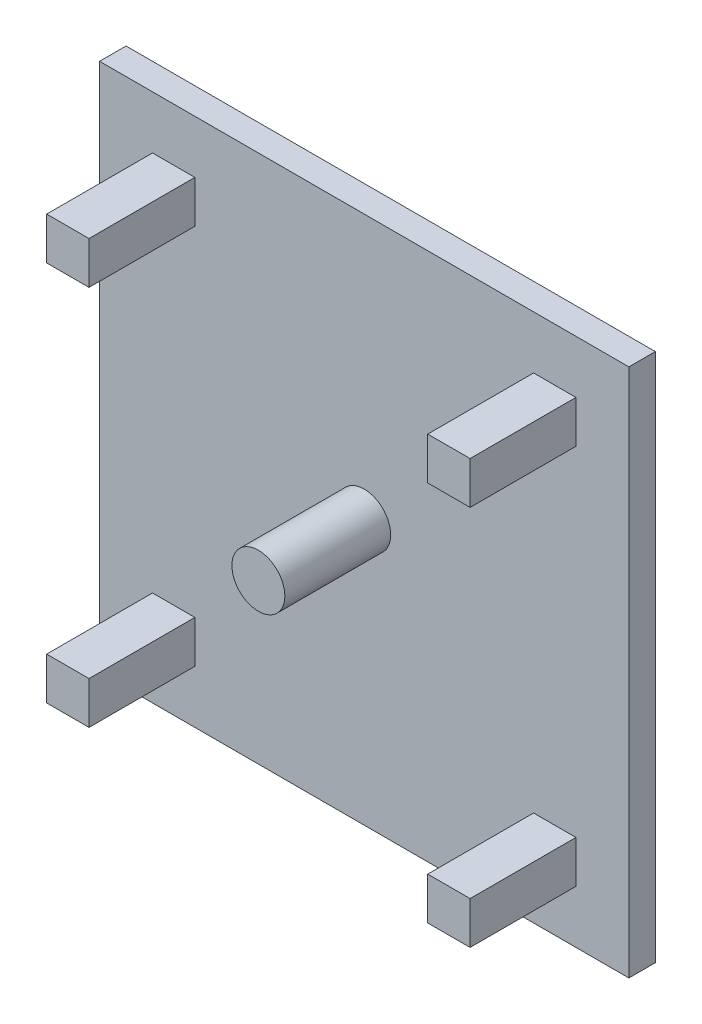
ISO-10303-21;
HEADER;
FILE_DESCRIPTION(('STEP AP214'),'2;1');
FILE_NAME('part.step','',(''),(''),'','','');
FILE_SCHEMA(('AUTOMOTIVE_DESIGN { 1 0 10303 214 1 1 1 1 }'));
ENDSEC;
DATA;
#1=APPLICATION_CONTEXT('core data for automotive mechanical design processes');
#2=APPLICATION_PROTOCOL_DEFINITION('international standard','automotive_design',2000,#1);
#3=PRODUCT_CONTEXT('',#1,'mechanical');
#4=PRODUCT('Part','Part','',(#3));
#5=PRODUCT_RELATED_PRODUCT_CATEGORY('part','',(#4));
#6=PRODUCT_DEFINITION_FORMATION('','',#4);
#7=PRODUCT_DEFINITION_CONTEXT('part definition',#1,'design');
#8=PRODUCT_DEFINITION('design','',#6,#7);
#9=PRODUCT_DEFINITION_SHAPE('','',#8);
#10=(LENGTH_UNIT() NAMED_UNIT(*) SI_UNIT(.MILLI.,.METRE.));
#11=(NAMED_UNIT(*) PLANE_ANGLE_UNIT() SI_UNIT($,.RADIAN.));
#12=(NAMED_UNIT(*) SI_UNIT($,.STERADIAN.) SOLID_ANGLE_UNIT());
#13=UNCERTAINTY_MEASURE_WITH_UNIT(LENGTH_MEASURE(1.E-05),#10,'distance_accuracy_value','');
#14=(GEOMETRIC_REPRESENTATION_CONTEXT(3) GLOBAL_UNCERTAINTY_ASSIGNED_CONTEXT((#13)) GLOBAL_UNIT_ASSIGNED_CONTEXT((#10,
#11,#12)) REPRESENTATION_CONTEXT('',''));
#15=CARTESIAN_POINT('',(0.,0.,0.));
#16=DIRECTION('',(0.,0.,1.));
#17=DIRECTION('',(1.,0.,0.));
#18=AXIS2_PLACEMENT_3D('',#15,#16,#17);
#19=CARTESIAN_POINT('',(0.,0.,25.));
#20=DIRECTION('',(1.,0.,0.));
#21=DIRECTION('',(0.,0.,-1.));
#22=AXIS2_PLACEMENT_3D('',#19,#20,#21);
#23=PLANE('',#22);
#24=DIRECTION('',(0.,0.,-1.));
#25=VECTOR('',#24,1.);
#26=CARTESIAN_POINT('',(0.,0.,25.));
#27=LINE('',#26,#25);
#28=CARTESIAN_POINT('',(0.,0.,4.99999999999995));
#29=VERTEX_POINT('',#28);
#30=CARTESIAN_POINT('',(0.,0.,0.));
#31=VERTEX_POINT('',#30);
#32=EDGE_CURVE('E12',#29,#31,#27,.T.);
#33=ORIENTED_EDGE('',*,*,#32,.F.);
#34=DIRECTION('',(0.,-1.,0.));
#35=VECTOR('',#34,1.);
#36=CARTESIAN_POINT('',(0.,100.,5.));
#37=LINE('',#36,#35);
#38=CARTESIAN_POINT('',(0.,100.,5.));
#39=VERTEX_POINT('',#38);
#40=EDGE_CURVE('E181',#39,#29,#37,.T.);
#41=ORIENTED_EDGE('',*,*,#40,.F.);
#42=DIRECTION('',(0.,0.,-1.));
#43=VECTOR('',#42,1.);
#44=CARTESIAN_POINT('',(0.,100.,25.));
#45=LINE('',#44,#43);
#46=CARTESIAN_POINT('',(0.,100.,0.));
#47=VERTEX_POINT('',#46);
#48=EDGE_CURVE('E203',#39,#47,#45,.T.);
#49=ORIENTED_EDGE('',*,*,#48,.T.);
#50=DIRECTION('',(0.,-1.,0.));
#51=VECTOR('',#50,1.);
#52=CARTESIAN_POINT('',(0.,0.,0.));
#53=LINE('',#52,#51);
#54=EDGE_CURVE('E202',#47,#31,#53,.T.);
#55=ORIENTED_EDGE('',*,*,#54,.T.);
#56=EDGE_LOOP('',(#33,#41,#49,#55));
#57=FACE_BOUND('',#56,.T.);
#58=ADVANCED_FACE('F47',(#57),#23,.F.);
#59=CARTESIAN_POINT('',(0.,0.,25.));
#60=DIRECTION('',(0.,1.,0.));
#61=DIRECTION('',(0.,0.,1.));
#62=AXIS2_PLACEMENT_3D('',#59,#60,#61);
#63=PLANE('',#62);
#64=DIRECTION('',(0.,0.,-1.));
#65=VECTOR('',#64,1.);
#66=CARTESIAN_POINT('',(100.,0.,25.));
#67=LINE('',#66,#65);
#68=CARTESIAN_POINT('',(100.,0.,5.));
#69=VERTEX_POINT('',#68);
#70=CARTESIAN_POINT('',(100.,0.,0.));
#71=VERTEX_POINT('',#70);
#72=EDGE_CURVE('E55',#69,#71,#67,.T.);
#73=ORIENTED_EDGE('',*,*,#72,.F.);
#74=DIRECTION('',(1.,0.,0.));
#75=VECTOR('',#74,1.);
#76=CARTESIAN_POINT('',(0.,0.,5.));
#77=LINE('',#76,#75);
#78=EDGE_CURVE('E185',#29,#69,#77,.T.);
#79=ORIENTED_EDGE('',*,*,#78,.F.);
#80=ORIENTED_EDGE('',*,*,#32,.T.);
#81=DIRECTION('',(1.,0.,0.));
#82=VECTOR('',#81,1.);
#83=CARTESIAN_POINT('',(0.,0.,0.));
#84=LINE('',#83,#82);
#85=EDGE_CURVE('E208',#31,#71,#84,.T.);
#86=ORIENTED_EDGE('',*,*,#85,.T.);
#87=EDGE_LOOP('',(#73,#79,#80,#86));
#88=FACE_BOUND('',#87,.T.);
#89=ADVANCED_FACE('F195',(#88),#63,.F.);
#90=CARTESIAN_POINT('',(100.,0.,25.));
#91=DIRECTION('',(-1.,0.,0.));
#92=DIRECTION('',(0.,0.,1.));
#93=AXIS2_PLACEMENT_3D('',#90,#91,#92);
#94=PLANE('',#93);
#95=DIRECTION('',(0.,0.,-1.));
#96=VECTOR('',#95,1.);
#97=CARTESIAN_POINT('',(100.,100.,25.));
#98=LINE('',#97,#96);
#99=CARTESIAN_POINT('',(100.,100.,5.));
#100=VERTEX_POINT('',#99);
#101=CARTESIAN_POINT('',(100.,100.,0.));
#102=VERTEX_POINT('',#101);
#103=EDGE_CURVE('E230',#100,#102,#98,.T.);
#104=ORIENTED_EDGE('',*,*,#103,.F.);
#105=DIRECTION('',(0.,1.,0.));
#106=VECTOR('',#105,1.);
#107=CARTESIAN_POINT('',(100.,0.,5.));
#108=LINE('',#107,#106);
#109=EDGE_CURVE('E62',#69,#100,#108,.T.);
#110=ORIENTED_EDGE('',*,*,#109,.F.);
#111=ORIENTED_EDGE('',*,*,#72,.T.);
#112=DIRECTION('',(0.,1.,0.));
#113=VECTOR('',#112,1.);
#114=CARTESIAN_POINT('',(100.,0.,0.));
#115=LINE('',#114,#113);
#116=EDGE_CURVE('E213',#71,#102,#115,.T.);
#117=ORIENTED_EDGE('',*,*,#116,.T.);
#118=EDGE_LOOP('',(#104,#110,#111,#117));
#119=FACE_BOUND('',#118,.T.);
#120=ADVANCED_FACE('F235',(#119),#94,.F.);
#121=CARTESIAN_POINT('',(0.,100.,25.));
#122=DIRECTION('',(0.,-1.,0.));
#123=DIRECTION('',(0.,0.,-1.));
#124=AXIS2_PLACEMENT_3D('',#121,#122,#123);
#125=PLANE('',#124);
#126=ORIENTED_EDGE('',*,*,#48,.F.);
#127=DIRECTION('',(-1.,0.,0.));
#128=VECTOR('',#127,1.);
#129=CARTESIAN_POINT('',(100.,100.,5.));
#130=LINE('',#129,#128);
#131=EDGE_CURVE('E186',#100,#39,#130,.T.);
#132=ORIENTED_EDGE('',*,*,#131,.F.);
#133=ORIENTED_EDGE('',*,*,#103,.T.);
#134=DIRECTION('',(-1.,0.,0.));
#135=VECTOR('',#134,1.);
#136=CARTESIAN_POINT('',(0.,100.,0.));
#137=LINE('',#136,#135);
#138=EDGE_CURVE('E225',#102,#47,#137,.T.);
#139=ORIENTED_EDGE('',*,*,#138,.T.);
#140=EDGE_LOOP('',(#126,#132,#133,#139));
#141=FACE_BOUND('',#140,.T.);
#142=ADVANCED_FACE('F239',(#141),#125,.F.);
#143=CARTESIAN_POINT('',(0.,0.,0.));
#144=DIRECTION('',(0.,0.,-1.));
#145=DIRECTION('',(-1.,0.,0.));
#146=AXIS2_PLACEMENT_3D('',#143,#144,#145);
#147=PLANE('',#146);
#148=ORIENTED_EDGE('',*,*,#54,.F.);
#149=ORIENTED_EDGE('',*,*,#138,.F.);
#150=ORIENTED_EDGE('',*,*,#116,.F.);
#151=ORIENTED_EDGE('',*,*,#85,.F.);
#152=EDGE_LOOP('',(#148,#149,#150,#151));
#153=FACE_BOUND('',#152,.T.);
#154=ADVANCED_FACE('F237',(#153),#147,.T.);
#155=CARTESIAN_POINT('',(10.,90.,-141.42135623731));
#156=DIRECTION('',(-1.,0.,0.));
#157=DIRECTION('',(0.,-1.,0.));
#158=AXIS2_PLACEMENT_3D('',#155,#156,#157);
#159=PLANE('',#158);
#160=DIRECTION('',(0.,-1.,0.));
#161=VECTOR('',#160,1.);
#162=CARTESIAN_POINT('',(10.,90.,5.));
#163=LINE('',#162,#161);
#164=CARTESIAN_POINT('',(10.,90.,4.99999999999995));
#165=VERTEX_POINT('',#164);
#166=CARTESIAN_POINT('',(10.,82.,4.99999999999995));
#167=VERTEX_POINT('',#166);
#168=EDGE_CURVE('E256',#165,#167,#163,.T.);
#169=ORIENTED_EDGE('',*,*,#168,.T.);
#170=DIRECTION('',(0.,0.,1.));
#171=VECTOR('',#170,1.);
#172=CARTESIAN_POINT('',(10.,82.,-141.42135623731));
#173=LINE('',#172,#171);
#174=CARTESIAN_POINT('',(10.,82.,25.));
#175=VERTEX_POINT('',#174);
#176=EDGE_CURVE('E284',#167,#175,#173,.T.);
#177=ORIENTED_EDGE('',*,*,#176,.T.);
#178=DIRECTION('',(0.,-1.,0.));
#179=VECTOR('',#178,1.);
#180=CARTESIAN_POINT('',(10.,90.,25.));
#181=LINE('',#180,#179);
#182=CARTESIAN_POINT('',(10.,90.,25.));
#183=VERTEX_POINT('',#182);
#184=EDGE_CURVE('E276',#183,#175,#181,.T.);
#185=ORIENTED_EDGE('',*,*,#184,.F.);
#186=DIRECTION('',(0.,0.,1.));
#187=VECTOR('',#186,1.);
#188=CARTESIAN_POINT('',(10.,90.,-141.42135623731));
#189=LINE('',#188,#187);
#190=EDGE_CURVE('E191',#165,#183,#189,.T.);
#191=ORIENTED_EDGE('',*,*,#190,.F.);
#192=EDGE_LOOP('',(#169,#177,#185,#191));
#193=FACE_BOUND('',#192,.T.);
#194=ADVANCED_FACE('F426',(#193),#159,.T.);
#195=CARTESIAN_POINT('',(10.,90.,-141.42135623731));
#196=DIRECTION('',(0.,1.,0.));
#197=DIRECTION('',(0.,0.,1.));
#198=AXIS2_PLACEMENT_3D('',#195,#196,#197);
#199=PLANE('',#198);
#200=DIRECTION('',(-1.,0.,0.));
#201=VECTOR('',#200,1.);
#202=CARTESIAN_POINT('',(10.,90.,5.));
#203=LINE('',#202,#201);
#204=CARTESIAN_POINT('',(18.,90.,4.99999999999995));
#205=VERTEX_POINT('',#204);
#206=EDGE_CURVE('E357',#205,#165,#203,.T.);
#207=ORIENTED_EDGE('',*,*,#206,.T.);
#208=ORIENTED_EDGE('',*,*,#190,.T.);
#209=DIRECTION('',(-1.,0.,0.));
#210=VECTOR('',#209,1.);
#211=CARTESIAN_POINT('',(10.,90.,25.));
#212=LINE('',#211,#210);
#213=CARTESIAN_POINT('',(18.,90.,25.));
#214=VERTEX_POINT('',#213);
#215=EDGE_CURVE('E280',#214,#183,#212,.T.);
#216=ORIENTED_EDGE('',*,*,#215,.F.);
#217=DIRECTION('',(0.,0.,1.));
#218=VECTOR('',#217,1.);
#219=CARTESIAN_POINT('',(18.,90.,-141.42135623731));
#220=LINE('',#219,#218);
#221=EDGE_CURVE('E277',#205,#214,#220,.T.);
#222=ORIENTED_EDGE('',*,*,#221,.F.);
#223=EDGE_LOOP('',(#207,#208,#216,#222));
#224=FACE_BOUND('',#223,.T.);
#225=ADVANCED_FACE('F568',(#224),#199,.T.);
#226=CARTESIAN_POINT('',(18.,90.,-141.42135623731));
#227=DIRECTION('',(1.,0.,0.));
#228=DIRECTION('',(0.,0.,-1.));
#229=AXIS2_PLACEMENT_3D('',#226,#227,#228);
#230=PLANE('',#229);
#231=DIRECTION('',(0.,1.,0.));
#232=VECTOR('',#231,1.);
#233=CARTESIAN_POINT('',(18.,90.,5.));
#234=LINE('',#233,#232);
#235=CARTESIAN_POINT('',(18.,82.,5.));
#236=VERTEX_POINT('',#235);
#237=EDGE_CURVE('E209',#236,#205,#234,.T.);
#238=ORIENTED_EDGE('',*,*,#237,.T.);
#239=ORIENTED_EDGE('',*,*,#221,.T.);
#240=DIRECTION('',(0.,1.,0.));
#241=VECTOR('',#240,1.);
#242=CARTESIAN_POINT('',(18.,90.,25.));
#243=LINE('',#242,#241);
#244=CARTESIAN_POINT('',(18.,82.,25.));
#245=VERTEX_POINT('',#244);
#246=EDGE_CURVE('E70',#245,#214,#243,.T.);
#247=ORIENTED_EDGE('',*,*,#246,.F.);
#248=DIRECTION('',(0.,0.,1.));
#249=VECTOR('',#248,1.);
#250=CARTESIAN_POINT('',(18.,82.,-141.42135623731));
#251=LINE('',#250,#249);
#252=EDGE_CURVE('E281',#236,#245,#251,.T.);
#253=ORIENTED_EDGE('',*,*,#252,.F.);
#254=EDGE_LOOP('',(#238,#239,#247,#253));
#255=FACE_BOUND('',#254,.T.);
#256=ADVANCED_FACE('F572',(#255),#230,.T.);
#257=CARTESIAN_POINT('',(10.,82.,-141.42135623731));
#258=DIRECTION('',(0.,-1.,0.));
#259=DIRECTION('',(0.,0.,-1.));
#260=AXIS2_PLACEMENT_3D('',#257,#258,#259);
#261=PLANE('',#260);
#262=DIRECTION('',(1.,0.,0.));
#263=VECTOR('',#262,1.);
#264=CARTESIAN_POINT('',(10.,82.,5.));
#265=LINE('',#264,#263);
#266=EDGE_CURVE('E216',#167,#236,#265,.T.);
#267=ORIENTED_EDGE('',*,*,#266,.T.);
#268=ORIENTED_EDGE('',*,*,#252,.T.);
#269=DIRECTION('',(1.,0.,0.));
#270=VECTOR('',#269,1.);
#271=CARTESIAN_POINT('',(10.,82.,25.));
#272=LINE('',#271,#270);
#273=EDGE_CURVE('E287',#175,#245,#272,.T.);
#274=ORIENTED_EDGE('',*,*,#273,.F.);
#275=ORIENTED_EDGE('',*,*,#176,.F.);
#276=EDGE_LOOP('',(#267,#268,#274,#275));
#277=FACE_BOUND('',#276,.T.);
#278=ADVANCED_FACE('F554',(#277),#261,.T.);
#279=CARTESIAN_POINT('',(90.,90.,-141.42135623731));
#280=DIRECTION('',(1.,0.,0.));
#281=DIRECTION('',(0.,0.,-1.));
#282=AXIS2_PLACEMENT_3D('',#279,#280,#281);
#283=PLANE('',#282);
#284=DIRECTION('',(0.,1.,0.));
#285=VECTOR('',#284,1.);
#286=CARTESIAN_POINT('',(90.,90.,5.));
#287=LINE('',#286,#285);
#288=CARTESIAN_POINT('',(90.,82.,4.99999999999995));
#289=VERTEX_POINT('',#288);
#290=CARTESIAN_POINT('',(90.,90.,4.99999999999995));
#291=VERTEX_POINT('',#290);
#292=EDGE_CURVE('E262',#289,#291,#287,.T.);
#293=ORIENTED_EDGE('',*,*,#292,.T.);
#294=DIRECTION('',(0.,0.,1.));
#295=VECTOR('',#294,1.);
#296=CARTESIAN_POINT('',(90.,90.,-141.42135623731));
#297=LINE('',#296,#295);
#298=CARTESIAN_POINT('',(90.,90.,25.));
#299=VERTEX_POINT('',#298);
#300=EDGE_CURVE('E301',#291,#299,#297,.T.);
#301=ORIENTED_EDGE('',*,*,#300,.T.);
#302=DIRECTION('',(0.,1.,0.));
#303=VECTOR('',#302,1.);
#304=CARTESIAN_POINT('',(90.,90.,25.));
#305=LINE('',#304,#303);
#306=CARTESIAN_POINT('',(90.,82.,25.));
#307=VERTEX_POINT('',#306);
#308=EDGE_CURVE('E291',#307,#299,#305,.T.);
#309=ORIENTED_EDGE('',*,*,#308,.F.);
#310=DIRECTION('',(0.,0.,1.));
#311=VECTOR('',#310,1.);
#312=CARTESIAN_POINT('',(90.,82.,-141.42135623731));
#313=LINE('',#312,#311);
#314=EDGE_CURVE('E288',#289,#307,#313,.T.);
#315=ORIENTED_EDGE('',*,*,#314,.F.);
#316=EDGE_LOOP('',(#293,#301,#309,#315));
#317=FACE_BOUND('',#316,.T.);
#318=ADVANCED_FACE('F550',(#317),#283,.T.);
#319=CARTESIAN_POINT('',(90.,82.,-141.42135623731));
#320=DIRECTION('',(0.,-1.,0.));
#321=DIRECTION('',(0.,0.,-1.));
#322=AXIS2_PLACEMENT_3D('',#319,#320,#321);
#323=PLANE('',#322);
#324=DIRECTION('',(1.,0.,0.));
#325=VECTOR('',#324,1.);
#326=CARTESIAN_POINT('',(90.,82.,5.));
#327=LINE('',#326,#325);
#328=CARTESIAN_POINT('',(82.,82.,4.99999999999995));
#329=VERTEX_POINT('',#328);
#330=EDGE_CURVE('E364',#329,#289,#327,.T.);
#331=ORIENTED_EDGE('',*,*,#330,.T.);
#332=ORIENTED_EDGE('',*,*,#314,.T.);
#333=DIRECTION('',(1.,0.,0.));
#334=VECTOR('',#333,1.);
#335=CARTESIAN_POINT('',(90.,82.,25.));
#336=LINE('',#335,#334);
#337=CARTESIAN_POINT('',(82.,82.,25.));
#338=VERTEX_POINT('',#337);
#339=EDGE_CURVE('E295',#338,#307,#336,.T.);
#340=ORIENTED_EDGE('',*,*,#339,.F.);
#341=DIRECTION('',(0.,0.,1.));
#342=VECTOR('',#341,1.);
#343=CARTESIAN_POINT('',(82.,82.,-141.42135623731));
#344=LINE('',#343,#342);
#345=EDGE_CURVE('E292',#329,#338,#344,.T.);
#346=ORIENTED_EDGE('',*,*,#345,.F.);
#347=EDGE_LOOP('',(#331,#332,#340,#346));
#348=FACE_BOUND('',#347,.T.);
#349=ADVANCED_FACE('F553',(#348),#323,.T.);
#350=CARTESIAN_POINT('',(82.,90.,-141.42135623731));
#351=DIRECTION('',(-1.,0.,0.));
#352=DIRECTION('',(0.,0.,1.));
#353=AXIS2_PLACEMENT_3D('',#350,#351,#352);
#354=PLANE('',#353);
#355=DIRECTION('',(0.,-1.,0.));
#356=VECTOR('',#355,1.);
#357=CARTESIAN_POINT('',(82.,90.,5.));
#358=LINE('',#357,#356);
#359=CARTESIAN_POINT('',(82.,90.,5.));
#360=VERTEX_POINT('',#359);
#361=EDGE_CURVE('E261',#360,#329,#358,.T.);
#362=ORIENTED_EDGE('',*,*,#361,.T.);
#363=ORIENTED_EDGE('',*,*,#345,.T.);
#364=DIRECTION('',(0.,-1.,0.));
#365=VECTOR('',#364,1.);
#366=CARTESIAN_POINT('',(82.,90.,25.));
#367=LINE('',#366,#365);
#368=CARTESIAN_POINT('',(82.,90.,25.));
#369=VERTEX_POINT('',#368);
#370=EDGE_CURVE('E300',#369,#338,#367,.T.);
#371=ORIENTED_EDGE('',*,*,#370,.F.);
#372=DIRECTION('',(0.,0.,1.));
#373=VECTOR('',#372,1.);
#374=CARTESIAN_POINT('',(82.,90.,-141.42135623731));
#375=LINE('',#374,#373);
#376=EDGE_CURVE('E296',#360,#369,#375,.T.);
#377=ORIENTED_EDGE('',*,*,#376,.F.);
#378=EDGE_LOOP('',(#362,#363,#371,#377));
#379=FACE_BOUND('',#378,.T.);
#380=ADVANCED_FACE('F558',(#379),#354,.T.);
#381=CARTESIAN_POINT('',(90.,90.,-141.42135623731));
#382=DIRECTION('',(0.,1.,0.));
#383=DIRECTION('',(0.,0.,1.));
#384=AXIS2_PLACEMENT_3D('',#381,#382,#383);
#385=PLANE('',#384);
#386=DIRECTION('',(-1.,0.,0.));
#387=VECTOR('',#386,1.);
#388=CARTESIAN_POINT('',(90.,90.,5.));
#389=LINE('',#388,#387);
#390=EDGE_CURVE('E257',#291,#360,#389,.T.);
#391=ORIENTED_EDGE('',*,*,#390,.T.);
#392=ORIENTED_EDGE('',*,*,#376,.T.);
#393=DIRECTION('',(-1.,0.,0.));
#394=VECTOR('',#393,1.);
#395=CARTESIAN_POINT('',(90.,90.,25.));
#396=LINE('',#395,#394);
#397=EDGE_CURVE('E304',#299,#369,#396,.T.);
#398=ORIENTED_EDGE('',*,*,#397,.F.);
#399=ORIENTED_EDGE('',*,*,#300,.F.);
#400=EDGE_LOOP('',(#391,#392,#398,#399));
#401=FACE_BOUND('',#400,.T.);
#402=ADVANCED_FACE('F547',(#401),#385,.T.);
#403=CARTESIAN_POINT('',(10.,18.,-141.42135623731));
#404=DIRECTION('',(-1.,0.,0.));
#405=DIRECTION('',(0.,-1.,0.));
#406=AXIS2_PLACEMENT_3D('',#403,#404,#405);
#407=PLANE('',#406);
#408=DIRECTION('',(0.,-1.,0.));
#409=VECTOR('',#408,1.);
#410=CARTESIAN_POINT('',(10.,18.,5.));
#411=LINE('',#410,#409);
#412=CARTESIAN_POINT('',(10.,18.,4.99999999999995));
#413=VERTEX_POINT('',#412);
#414=CARTESIAN_POINT('',(10.,10.,4.99999999999995));
#415=VERTEX_POINT('',#414);
#416=EDGE_CURVE('E268',#413,#415,#411,.T.);
#417=ORIENTED_EDGE('',*,*,#416,.T.);
#418=DIRECTION('',(0.,0.,1.));
#419=VECTOR('',#418,1.);
#420=CARTESIAN_POINT('',(10.,10.,-141.42135623731));
#421=LINE('',#420,#419);
#422=CARTESIAN_POINT('',(10.,10.,25.));
#423=VERTEX_POINT('',#422);
#424=EDGE_CURVE('E318',#415,#423,#421,.T.);
#425=ORIENTED_EDGE('',*,*,#424,.T.);
#426=DIRECTION('',(0.,-1.,0.));
#427=VECTOR('',#426,1.);
#428=CARTESIAN_POINT('',(10.,18.,25.));
#429=LINE('',#428,#427);
#430=CARTESIAN_POINT('',(10.,18.,25.));
#431=VERTEX_POINT('',#430);
#432=EDGE_CURVE('E308',#431,#423,#429,.T.);
#433=ORIENTED_EDGE('',*,*,#432,.F.);
#434=DIRECTION('',(0.,0.,1.));
#435=VECTOR('',#434,1.);
#436=CARTESIAN_POINT('',(10.,18.,-141.42135623731));
#437=LINE('',#436,#435);
#438=EDGE_CURVE('E305',#413,#431,#437,.T.);
#439=ORIENTED_EDGE('',*,*,#438,.F.);
#440=EDGE_LOOP('',(#417,#425,#433,#439));
#441=FACE_BOUND('',#440,.T.);
#442=ADVANCED_FACE('F537',(#441),#407,.T.);
#443=CARTESIAN_POINT('',(10.,18.,-141.42135623731));
#444=DIRECTION('',(0.,1.,0.));
#445=DIRECTION('',(0.,0.,1.));
#446=AXIS2_PLACEMENT_3D('',#443,#444,#445);
#447=PLANE('',#446);
#448=DIRECTION('',(-1.,0.,0.));
#449=VECTOR('',#448,1.);
#450=CARTESIAN_POINT('',(10.,18.,5.));
#451=LINE('',#450,#449);
#452=CARTESIAN_POINT('',(18.,18.,4.99999999999995));
#453=VERTEX_POINT('',#452);
#454=EDGE_CURVE('E374',#453,#413,#451,.T.);
#455=ORIENTED_EDGE('',*,*,#454,.T.);
#456=ORIENTED_EDGE('',*,*,#438,.T.);
#457=DIRECTION('',(-1.,0.,0.));
#458=VECTOR('',#457,1.);
#459=CARTESIAN_POINT('',(10.,18.,25.));
#460=LINE('',#459,#458);
#461=CARTESIAN_POINT('',(18.,18.,25.));
#462=VERTEX_POINT('',#461);
#463=EDGE_CURVE('E312',#462,#431,#460,.T.);
#464=ORIENTED_EDGE('',*,*,#463,.F.);
#465=DIRECTION('',(0.,0.,1.));
#466=VECTOR('',#465,1.);
#467=CARTESIAN_POINT('',(18.,18.,-141.42135623731));
#468=LINE('',#467,#466);
#469=EDGE_CURVE('E309',#453,#462,#468,.T.);
#470=ORIENTED_EDGE('',*,*,#469,.F.);
#471=EDGE_LOOP('',(#455,#456,#464,#470));
#472=FACE_BOUND('',#471,.T.);
#473=ADVANCED_FACE('F539',(#472),#447,.T.);
#474=CARTESIAN_POINT('',(18.,18.,-141.42135623731));
#475=DIRECTION('',(1.,0.,0.));
#476=DIRECTION('',(0.,0.,-1.));
#477=AXIS2_PLACEMENT_3D('',#474,#475,#476);
#478=PLANE('',#477);
#479=DIRECTION('',(0.,1.,0.));
#480=VECTOR('',#479,1.);
#481=CARTESIAN_POINT('',(18.,18.,5.));
#482=LINE('',#481,#480);
#483=CARTESIAN_POINT('',(18.,10.,5.));
#484=VERTEX_POINT('',#483);
#485=EDGE_CURVE('E267',#484,#453,#482,.T.);
#486=ORIENTED_EDGE('',*,*,#485,.T.);
#487=ORIENTED_EDGE('',*,*,#469,.T.);
#488=DIRECTION('',(0.,1.,0.));
#489=VECTOR('',#488,1.);
#490=CARTESIAN_POINT('',(18.,18.,25.));
#491=LINE('',#490,#489);
#492=CARTESIAN_POINT('',(18.,10.,25.));
#493=VERTEX_POINT('',#492);
#494=EDGE_CURVE('E317',#493,#462,#491,.T.);
#495=ORIENTED_EDGE('',*,*,#494,.F.);
#496=DIRECTION('',(0.,0.,1.));
#497=VECTOR('',#496,1.);
#498=CARTESIAN_POINT('',(18.,10.,-141.42135623731));
#499=LINE('',#498,#497);
#500=EDGE_CURVE('E313',#484,#493,#499,.T.);
#501=ORIENTED_EDGE('',*,*,#500,.F.);
#502=EDGE_LOOP('',(#486,#487,#495,#501));
#503=FACE_BOUND('',#502,.T.);
#504=ADVANCED_FACE('F531',(#503),#478,.T.);
#505=CARTESIAN_POINT('',(10.,10.,-141.42135623731));
#506=DIRECTION('',(0.,-1.,0.));
#507=DIRECTION('',(0.,0.,-1.));
#508=AXIS2_PLACEMENT_3D('',#505,#506,#507);
#509=PLANE('',#508);
#510=DIRECTION('',(1.,0.,0.));
#511=VECTOR('',#510,1.);
#512=CARTESIAN_POINT('',(10.,10.,5.));
#513=LINE('',#512,#511);
#514=EDGE_CURVE('E263',#415,#484,#513,.T.);
#515=ORIENTED_EDGE('',*,*,#514,.T.);
#516=ORIENTED_EDGE('',*,*,#500,.T.);
#517=DIRECTION('',(1.,0.,0.));
#518=VECTOR('',#517,1.);
#519=CARTESIAN_POINT('',(10.,10.,25.));
#520=LINE('',#519,#518);
#521=EDGE_CURVE('E321',#423,#493,#520,.T.);
#522=ORIENTED_EDGE('',*,*,#521,.F.);
#523=ORIENTED_EDGE('',*,*,#424,.F.);
#524=EDGE_LOOP('',(#515,#516,#522,#523));
#525=FACE_BOUND('',#524,.T.);
#526=ADVANCED_FACE('F434',(#525),#509,.T.);
#527=CARTESIAN_POINT('',(82.,18.,-141.42135623731));
#528=DIRECTION('',(-1.,0.,0.));
#529=DIRECTION('',(0.,0.,1.));
#530=AXIS2_PLACEMENT_3D('',#527,#528,#529);
#531=PLANE('',#530);
#532=DIRECTION('',(0.,-1.,0.));
#533=VECTOR('',#532,1.);
#534=CARTESIAN_POINT('',(82.,18.,5.));
#535=LINE('',#534,#533);
#536=CARTESIAN_POINT('',(82.,18.,4.99999999999995));
#537=VERTEX_POINT('',#536);
#538=CARTESIAN_POINT('',(82.,10.,4.99999999999995));
#539=VERTEX_POINT('',#538);
#540=EDGE_CURVE('E273',#537,#539,#535,.T.);
#541=ORIENTED_EDGE('',*,*,#540,.T.);
#542=DIRECTION('',(0.,0.,1.));
#543=VECTOR('',#542,1.);
#544=CARTESIAN_POINT('',(82.,10.,-141.42135623731));
#545=LINE('',#544,#543);
#546=CARTESIAN_POINT('',(82.,10.,25.));
#547=VERTEX_POINT('',#546);
#548=EDGE_CURVE('E219',#539,#547,#545,.T.);
#549=ORIENTED_EDGE('',*,*,#548,.T.);
#550=DIRECTION('',(0.,-1.,0.));
#551=VECTOR('',#550,1.);
#552=CARTESIAN_POINT('',(82.,18.,25.));
#553=LINE('',#552,#551);
#554=CARTESIAN_POINT('',(82.,18.,25.));
#555=VERTEX_POINT('',#554);
#556=EDGE_CURVE('E325',#555,#547,#553,.T.);
#557=ORIENTED_EDGE('',*,*,#556,.F.);
#558=DIRECTION('',(0.,0.,1.));
#559=VECTOR('',#558,1.);
#560=CARTESIAN_POINT('',(82.,18.,-141.42135623731));
#561=LINE('',#560,#559);
#562=EDGE_CURVE('E322',#537,#555,#561,.T.);
#563=ORIENTED_EDGE('',*,*,#562,.F.);
#564=EDGE_LOOP('',(#541,#549,#557,#563));
#565=FACE_BOUND('',#564,.T.);
#566=ADVANCED_FACE('F395',(#565),#531,.T.);
#567=CARTESIAN_POINT('',(82.,18.,-141.42135623731));
#568=DIRECTION('',(0.,1.,0.));
#569=DIRECTION('',(0.,0.,1.));
#570=AXIS2_PLACEMENT_3D('',#567,#568,#569);
#571=PLANE('',#570);
#572=DIRECTION('',(-1.,0.,0.));
#573=VECTOR('',#572,1.);
#574=CARTESIAN_POINT('',(82.,18.,5.));
#575=LINE('',#574,#573);
#576=CARTESIAN_POINT('',(90.,18.,4.99999999999995));
#577=VERTEX_POINT('',#576);
#578=EDGE_CURVE('E351',#577,#537,#575,.T.);
#579=ORIENTED_EDGE('',*,*,#578,.T.);
#580=ORIENTED_EDGE('',*,*,#562,.T.);
#581=DIRECTION('',(-1.,0.,0.));
#582=VECTOR('',#581,1.);
#583=CARTESIAN_POINT('',(82.,18.,25.));
#584=LINE('',#583,#582);
#585=CARTESIAN_POINT('',(90.,18.,25.));
#586=VERTEX_POINT('',#585);
#587=EDGE_CURVE('E328',#586,#555,#584,.T.);
#588=ORIENTED_EDGE('',*,*,#587,.F.);
#589=DIRECTION('',(0.,0.,1.));
#590=VECTOR('',#589,1.);
#591=CARTESIAN_POINT('',(90.,18.,-141.42135623731));
#592=LINE('',#591,#590);
#593=EDGE_CURVE('E326',#577,#586,#592,.T.);
#594=ORIENTED_EDGE('',*,*,#593,.F.);
#595=EDGE_LOOP('',(#579,#580,#588,#594));
#596=FACE_BOUND('',#595,.T.);
#597=ADVANCED_FACE('F387',(#596),#571,.T.);
#598=CARTESIAN_POINT('',(90.,18.,-141.42135623731));
#599=DIRECTION('',(1.,0.,0.));
#600=DIRECTION('',(0.,0.,-1.));
#601=AXIS2_PLACEMENT_3D('',#598,#599,#600);
#602=PLANE('',#601);
#603=DIRECTION('',(0.,1.,0.));
#604=VECTOR('',#603,1.);
#605=CARTESIAN_POINT('',(90.,18.,5.));
#606=LINE('',#605,#604);
#607=CARTESIAN_POINT('',(90.,10.,5.));
#608=VERTEX_POINT('',#607);
#609=EDGE_CURVE('E250',#608,#577,#606,.T.);
#610=ORIENTED_EDGE('',*,*,#609,.T.);
#611=ORIENTED_EDGE('',*,*,#593,.T.);
#612=DIRECTION('',(0.,1.,0.));
#613=VECTOR('',#612,1.);
#614=CARTESIAN_POINT('',(90.,18.,25.));
#615=LINE('',#614,#613);
#616=CARTESIAN_POINT('',(90.,10.,25.));
#617=VERTEX_POINT('',#616);
#618=EDGE_CURVE('E332',#617,#586,#615,.T.);
#619=ORIENTED_EDGE('',*,*,#618,.F.);
#620=DIRECTION('',(0.,0.,1.));
#621=VECTOR('',#620,1.);
#622=CARTESIAN_POINT('',(90.,10.,-141.42135623731));
#623=LINE('',#622,#621);
#624=EDGE_CURVE('E329',#608,#617,#623,.T.);
#625=ORIENTED_EDGE('',*,*,#624,.F.);
#626=EDGE_LOOP('',(#610,#611,#619,#625));
#627=FACE_BOUND('',#626,.T.);
#628=ADVANCED_FACE('F400',(#627),#602,.T.);
#629=CARTESIAN_POINT('',(82.,10.,-141.42135623731));
#630=DIRECTION('',(0.,-1.,0.));
#631=DIRECTION('',(0.,0.,-1.));
#632=AXIS2_PLACEMENT_3D('',#629,#630,#631);
#633=PLANE('',#632);
#634=DIRECTION('',(1.,0.,0.));
#635=VECTOR('',#634,1.);
#636=CARTESIAN_POINT('',(82.,10.,5.));
#637=LINE('',#636,#635);
#638=EDGE_CURVE('E269',#539,#608,#637,.T.);
#639=ORIENTED_EDGE('',*,*,#638,.T.);
#640=ORIENTED_EDGE('',*,*,#624,.T.);
#641=DIRECTION('',(1.,0.,0.));
#642=VECTOR('',#641,1.);
#643=CARTESIAN_POINT('',(82.,10.,25.));
#644=LINE('',#643,#642);
#645=EDGE_CURVE('E348',#547,#617,#644,.T.);
#646=ORIENTED_EDGE('',*,*,#645,.F.);
#647=ORIENTED_EDGE('',*,*,#548,.F.);
#648=EDGE_LOOP('',(#639,#640,#646,#647));
#649=FACE_BOUND('',#648,.T.);
#650=ADVANCED_FACE('F397',(#649),#633,.T.);
#651=CARTESIAN_POINT('',(0.,0.,5.));
#652=DIRECTION('',(0.,0.,-1.));
#653=DIRECTION('',(-1.,0.,0.));
#654=AXIS2_PLACEMENT_3D('',#651,#652,#653);
#655=PLANE('',#654);
#656=CARTESIAN_POINT('',(50.,50.,5.));
#657=DIRECTION('',(0.,0.,-1.));
#658=DIRECTION('',(-1.,0.,0.));
#659=AXIS2_PLACEMENT_3D('',#656,#657,#658);
#660=CIRCLE('',#659,5.);
#661=CARTESIAN_POINT('',(45.,50.,5.));
#662=VERTEX_POINT('',#661);
#663=EDGE_CURVE('E241',#662,#662,#660,.F.);
#664=ORIENTED_EDGE('',*,*,#663,.F.);
#665=EDGE_LOOP('',(#664));
#666=FACE_BOUND('',#665,.T.);
#667=ORIENTED_EDGE('',*,*,#131,.T.);
#668=ORIENTED_EDGE('',*,*,#40,.T.);
#669=ORIENTED_EDGE('',*,*,#78,.T.);
#670=ORIENTED_EDGE('',*,*,#109,.T.);
#671=EDGE_LOOP('',(#667,#668,#669,#670));
#672=FACE_BOUND('',#671,.T.);
#673=ORIENTED_EDGE('',*,*,#578,.F.);
#674=ORIENTED_EDGE('',*,*,#609,.F.);
#675=ORIENTED_EDGE('',*,*,#638,.F.);
#676=ORIENTED_EDGE('',*,*,#540,.F.);
#677=EDGE_LOOP('',(#673,#674,#675,#676));
#678=FACE_BOUND('',#677,.T.);
#679=ORIENTED_EDGE('',*,*,#454,.F.);
#680=ORIENTED_EDGE('',*,*,#485,.F.);
#681=ORIENTED_EDGE('',*,*,#514,.F.);
#682=ORIENTED_EDGE('',*,*,#416,.F.);
#683=EDGE_LOOP('',(#679,#680,#681,#682));
#684=FACE_BOUND('',#683,.T.);
#685=ORIENTED_EDGE('',*,*,#330,.F.);
#686=ORIENTED_EDGE('',*,*,#361,.F.);
#687=ORIENTED_EDGE('',*,*,#390,.F.);
#688=ORIENTED_EDGE('',*,*,#292,.F.);
#689=EDGE_LOOP('',(#685,#686,#687,#688));
#690=FACE_BOUND('',#689,.T.);
#691=ORIENTED_EDGE('',*,*,#206,.F.);
#692=ORIENTED_EDGE('',*,*,#237,.F.);
#693=ORIENTED_EDGE('',*,*,#266,.F.);
#694=ORIENTED_EDGE('',*,*,#168,.F.);
#695=EDGE_LOOP('',(#691,#692,#693,#694));
#696=FACE_BOUND('',#695,.T.);
#697=ADVANCED_FACE('F183',(#666,#672,#678,#684,#690,#696),#655,.F.);
#698=CARTESIAN_POINT('',(0.,0.,25.));
#699=DIRECTION('',(0.,0.,-1.));
#700=DIRECTION('',(-1.,0.,0.));
#701=AXIS2_PLACEMENT_3D('',#698,#699,#700);
#702=PLANE('',#701);
#703=ORIENTED_EDGE('',*,*,#432,.T.);
#704=ORIENTED_EDGE('',*,*,#521,.T.);
#705=ORIENTED_EDGE('',*,*,#494,.T.);
#706=ORIENTED_EDGE('',*,*,#463,.T.);
#707=EDGE_LOOP('',(#703,#704,#705,#706));
#708=FACE_BOUND('',#707,.T.);
#709=ADVANCED_FACE('F407',(#708),#702,.F.);
#710=ORIENTED_EDGE('',*,*,#308,.T.);
#711=ORIENTED_EDGE('',*,*,#397,.T.);
#712=ORIENTED_EDGE('',*,*,#370,.T.);
#713=ORIENTED_EDGE('',*,*,#339,.T.);
#714=EDGE_LOOP('',(#710,#711,#712,#713));
#715=FACE_BOUND('',#714,.T.);
#716=ADVANCED_FACE('F429',(#715),#702,.F.);
#717=ORIENTED_EDGE('',*,*,#184,.T.);
#718=ORIENTED_EDGE('',*,*,#273,.T.);
#719=ORIENTED_EDGE('',*,*,#246,.T.);
#720=ORIENTED_EDGE('',*,*,#215,.T.);
#721=EDGE_LOOP('',(#717,#718,#719,#720));
#722=FACE_BOUND('',#721,.T.);
#723=ADVANCED_FACE('F427',(#722),#702,.F.);
#724=ORIENTED_EDGE('',*,*,#556,.T.);
#725=ORIENTED_EDGE('',*,*,#645,.T.);
#726=ORIENTED_EDGE('',*,*,#618,.T.);
#727=ORIENTED_EDGE('',*,*,#587,.T.);
#728=EDGE_LOOP('',(#724,#725,#726,#727));
#729=FACE_BOUND('',#728,.T.);
#730=ADVANCED_FACE('F396',(#729),#702,.F.);
#731=CARTESIAN_POINT('',(50.,50.,25.));
#732=DIRECTION('',(0.,0.,1.));
#733=DIRECTION('',(1.,0.,0.));
#734=AXIS2_PLACEMENT_3D('',#731,#732,#733);
#735=PLANE('',#734);
#736=CARTESIAN_POINT('',(50.,50.,25.));
#737=DIRECTION('',(0.,0.,1.));
#738=DIRECTION('',(1.,0.,0.));
#739=AXIS2_PLACEMENT_3D('',#736,#737,#738);
#740=CIRCLE('',#739,5.);
#741=CARTESIAN_POINT('',(55.,50.,25.));
#742=VERTEX_POINT('',#741);
#743=EDGE_CURVE('E247',#742,#742,#740,.T.);
#744=ORIENTED_EDGE('',*,*,#743,.T.);
#745=EDGE_LOOP('',(#744));
#746=FACE_BOUND('',#745,.T.);
#747=ADVANCED_FACE('F464',(#746),#735,.T.);
#748=CARTESIAN_POINT('',(50.,50.,-0.00199999999999853));
#749=DIRECTION('',(0.,0.,1.));
#750=DIRECTION('',(1.,0.,0.));
#751=AXIS2_PLACEMENT_3D('',#748,#749,#750);
#752=CYLINDRICAL_SURFACE('',#751,5.);
#753=ORIENTED_EDGE('',*,*,#743,.F.);
#754=EDGE_LOOP('',(#753));
#755=FACE_BOUND('',#754,.T.);
#756=ORIENTED_EDGE('',*,*,#663,.T.);
#757=EDGE_LOOP('',(#756));
#758=FACE_BOUND('',#757,.T.);
#759=ADVANCED_FACE('F468',(#755,#758),#752,.T.);
#760=CLOSED_SHELL('',(#58,#89,#120,#142,#154,#194,#225,#256,#278,#318,#349,#380,#402,#442,#473,
#504,#526,#566,#597,#628,#650,#697,#709,#716,#723,#730,#747,#759));
#761=MANIFOLD_SOLID_BREP('B2',#760);
#762=ADVANCED_BREP_SHAPE_REPRESENTATION('',(#18,#761),#14);
#763=SHAPE_DEFINITION_REPRESENTATION(#9,#762);
ENDSEC;
END-ISO-10303-21;
